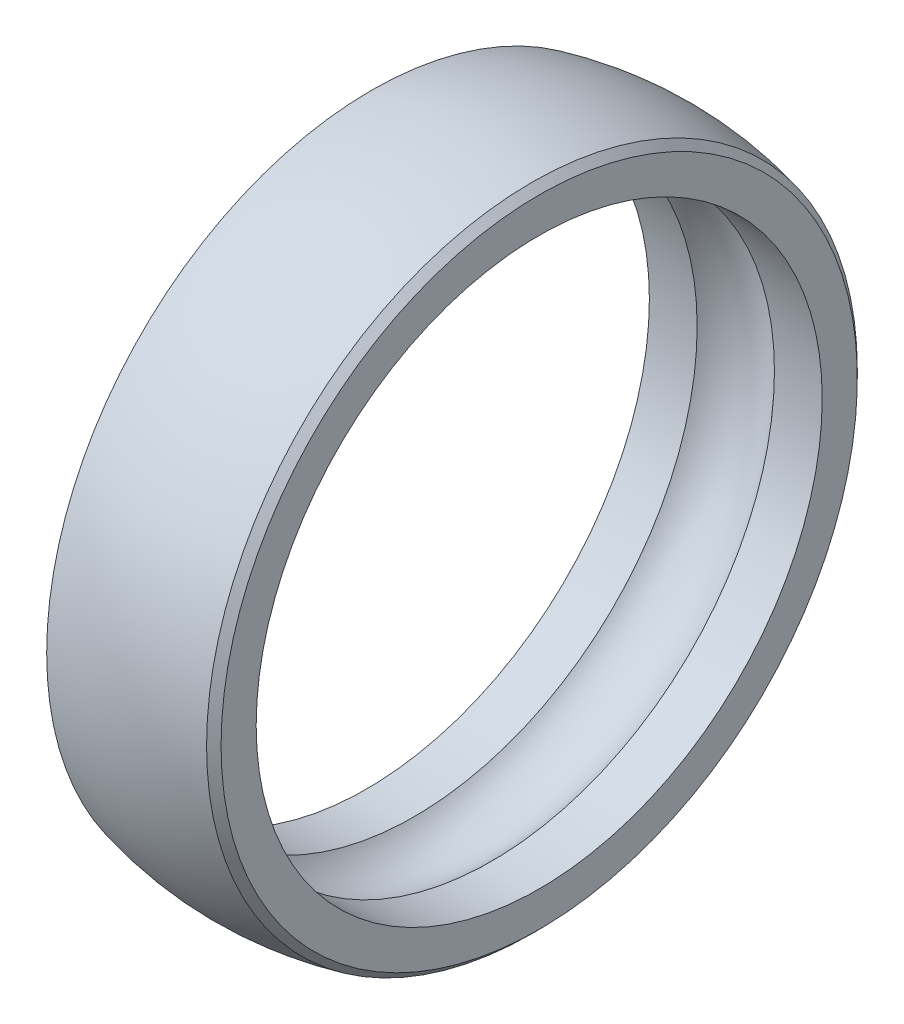
ISO-10303-21;
HEADER;
FILE_DESCRIPTION(('STEP AP214'),'2;1');
FILE_NAME('part.step','',(''),(''),'','','');
FILE_SCHEMA(('AUTOMOTIVE_DESIGN { 1 0 10303 214 1 1 1 1 }'));
ENDSEC;
DATA;
#1=APPLICATION_CONTEXT('core data for automotive mechanical design processes');
#2=APPLICATION_PROTOCOL_DEFINITION('international standard','automotive_design',2000,#1);
#3=PRODUCT_CONTEXT('',#1,'mechanical');
#4=PRODUCT('Part','Part','',(#3));
#5=PRODUCT_RELATED_PRODUCT_CATEGORY('part','',(#4));
#6=PRODUCT_DEFINITION_FORMATION('','',#4);
#7=PRODUCT_DEFINITION_CONTEXT('part definition',#1,'design');
#8=PRODUCT_DEFINITION('design','',#6,#7);
#9=PRODUCT_DEFINITION_SHAPE('','',#8);
#10=(LENGTH_UNIT() NAMED_UNIT(*) SI_UNIT(.MILLI.,.METRE.));
#11=(NAMED_UNIT(*) PLANE_ANGLE_UNIT() SI_UNIT($,.RADIAN.));
#12=(NAMED_UNIT(*) SI_UNIT($,.STERADIAN.) SOLID_ANGLE_UNIT());
#13=UNCERTAINTY_MEASURE_WITH_UNIT(LENGTH_MEASURE(1.E-05),#10,'distance_accuracy_value','');
#14=(GEOMETRIC_REPRESENTATION_CONTEXT(3) GLOBAL_UNCERTAINTY_ASSIGNED_CONTEXT((#13)) GLOBAL_UNIT_ASSIGNED_CONTEXT((#10,
#11,#12)) REPRESENTATION_CONTEXT('',''));
#15=CARTESIAN_POINT('',(0.,0.,0.));
#16=DIRECTION('',(0.,0.,1.));
#17=DIRECTION('',(1.,0.,0.));
#18=AXIS2_PLACEMENT_3D('',#15,#16,#17);
#19=CARTESIAN_POINT('',(0.,0.,-30.));
#20=DIRECTION('',(1.,0.,0.));
#21=DIRECTION('',(0.,0.,-1.));
#22=AXIS2_PLACEMENT_3D('',#19,#20,#21);
#23=PLANE('',#22);
#24=CARTESIAN_POINT('',(0.,0.,0.));
#25=DIRECTION('',(1.,0.,0.));
#26=DIRECTION('',(0.,0.,-1.));
#27=AXIS2_PLACEMENT_3D('',#24,#25,#26);
#28=CIRCLE('',#27,29.2438065793645);
#29=CARTESIAN_POINT('',(0.,0.,-29.2438065793645));
#30=VERTEX_POINT('',#29);
#31=EDGE_CURVE('E10',#30,#30,#28,.F.);
#32=ORIENTED_EDGE('',*,*,#31,.T.);
#33=EDGE_LOOP('',(#32));
#34=FACE_BOUND('',#33,.T.);
#35=CARTESIAN_POINT('',(0.,0.,0.));
#36=DIRECTION('',(-1.,0.,0.));
#37=DIRECTION('',(0.,0.,1.));
#38=AXIS2_PLACEMENT_3D('',#35,#36,#37);
#39=CIRCLE('',#38,26.2);
#40=CARTESIAN_POINT('',(0.,0.,26.2));
#41=VERTEX_POINT('',#40);
#42=EDGE_CURVE('E56',#41,#41,#39,.T.);
#43=ORIENTED_EDGE('',*,*,#42,.F.);
#44=EDGE_LOOP('',(#43));
#45=FACE_BOUND('',#44,.T.);
#46=ADVANCED_FACE('F34',(#34,#45),#23,.F.);
#47=CARTESIAN_POINT('',(16.,0.,-30.));
#48=DIRECTION('',(-1.,0.,0.));
#49=DIRECTION('',(0.,0.,1.));
#50=AXIS2_PLACEMENT_3D('',#47,#48,#49);
#51=PLANE('',#50);
#52=CARTESIAN_POINT('',(16.,0.,0.));
#53=DIRECTION('',(-1.,0.,0.));
#54=DIRECTION('',(0.,0.,1.));
#55=AXIS2_PLACEMENT_3D('',#52,#53,#54);
#56=CIRCLE('',#55,29.4499582637439);
#57=CARTESIAN_POINT('',(16.,0.,29.4499582637439));
#58=VERTEX_POINT('',#57);
#59=EDGE_CURVE('E40',#58,#58,#56,.F.);
#60=ORIENTED_EDGE('',*,*,#59,.T.);
#61=EDGE_LOOP('',(#60));
#62=FACE_BOUND('',#61,.T.);
#63=CARTESIAN_POINT('',(16.,0.,0.));
#64=DIRECTION('',(-1.,0.,0.));
#65=DIRECTION('',(0.,0.,1.));
#66=AXIS2_PLACEMENT_3D('',#63,#64,#65);
#67=CIRCLE('',#66,26.2);
#68=CARTESIAN_POINT('',(16.,0.,26.2));
#69=VERTEX_POINT('',#68);
#70=EDGE_CURVE('E65',#69,#69,#67,.T.);
#71=ORIENTED_EDGE('',*,*,#70,.T.);
#72=EDGE_LOOP('',(#71));
#73=FACE_BOUND('',#72,.T.);
#74=ADVANCED_FACE('F69',(#62,#73),#51,.F.);
#75=CARTESIAN_POINT('',(0.,0.,0.));
#76=DIRECTION('',(-1.,0.,0.));
#77=DIRECTION('',(0.,0.,1.));
#78=AXIS2_PLACEMENT_3D('',#75,#76,#77);
#79=CYLINDRICAL_SURFACE('',#78,26.2);
#80=CARTESIAN_POINT('',(4.42229123600034,0.,0.));
#81=DIRECTION('',(-1.,0.,0.));
#82=DIRECTION('',(0.,0.,1.));
#83=AXIS2_PLACEMENT_3D('',#80,#81,#82);
#84=CIRCLE('',#83,26.2);
#85=CARTESIAN_POINT('',(4.42229123600034,0.,26.2));
#86=VERTEX_POINT('',#85);
#87=EDGE_CURVE('E59',#86,#86,#84,.T.);
#88=ORIENTED_EDGE('',*,*,#87,.F.);
#89=EDGE_LOOP('',(#88));
#90=FACE_BOUND('',#89,.T.);
#91=ORIENTED_EDGE('',*,*,#42,.T.);
#92=EDGE_LOOP('',(#91));
#93=FACE_BOUND('',#92,.T.);
#94=ADVANCED_FACE('F81',(#90,#93),#79,.F.);
#95=CARTESIAN_POINT('',(8.,0.,0.));
#96=DIRECTION('',(-1.,0.,0.));
#97=DIRECTION('',(0.,0.,1.));
#98=AXIS2_PLACEMENT_3D('',#95,#96,#97);
#99=TOROIDAL_SURFACE('',#98,23.,4.8);
#100=CARTESIAN_POINT('',(11.5777087639997,0.,0.));
#101=DIRECTION('',(-1.,0.,0.));
#102=DIRECTION('',(0.,0.,1.));
#103=AXIS2_PLACEMENT_3D('',#100,#101,#102);
#104=CIRCLE('',#103,26.2);
#105=CARTESIAN_POINT('',(11.5777087639997,0.,26.2));
#106=VERTEX_POINT('',#105);
#107=EDGE_CURVE('E62',#106,#106,#104,.T.);
#108=ORIENTED_EDGE('',*,*,#107,.F.);
#109=EDGE_LOOP('',(#108));
#110=FACE_BOUND('',#109,.T.);
#111=ORIENTED_EDGE('',*,*,#87,.T.);
#112=EDGE_LOOP('',(#111));
#113=FACE_BOUND('',#112,.T.);
#114=ADVANCED_FACE('F75',(#110,#113),#99,.F.);
#115=CARTESIAN_POINT('',(0.,0.,0.));
#116=DIRECTION('',(-1.,0.,0.));
#117=DIRECTION('',(0.,0.,1.));
#118=AXIS2_PLACEMENT_3D('',#115,#116,#117);
#119=CYLINDRICAL_SURFACE('',#118,26.2);
#120=ORIENTED_EDGE('',*,*,#70,.F.);
#121=EDGE_LOOP('',(#120));
#122=FACE_BOUND('',#121,.T.);
#123=ORIENTED_EDGE('',*,*,#107,.T.);
#124=EDGE_LOOP('',(#123));
#125=FACE_BOUND('',#124,.T.);
#126=ADVANCED_FACE('F71',(#122,#125),#119,.F.);
#127=CARTESIAN_POINT('',(8.,0.,0.));
#128=DIRECTION('',(-1.,0.,0.));
#129=DIRECTION('',(0.,1.,0.));
#130=AXIS2_PLACEMENT_3D('',#127,#128,#129);
#131=SPHERICAL_SURFACE('',#130,31.);
#132=CARTESIAN_POINT('',(15.3287009450708,0.,0.));
#133=DIRECTION('',(-1.,0.,0.));
#134=DIRECTION('',(0.,0.,1.));
#135=AXIS2_PLACEMENT_3D('',#132,#133,#134);
#136=CIRCLE('',#135,30.1212573186731);
#137=CARTESIAN_POINT('',(15.3287009450708,30.1212573186731,0.));
#138=VERTEX_POINT('',#137);
#139=EDGE_CURVE('E45',#138,#138,#136,.T.);
#140=CARTESIAN_POINT('',(0.480253714426029,0.,0.));
#141=DIRECTION('',(1.,0.,0.));
#142=DIRECTION('',(0.,0.,-1.));
#143=AXIS2_PLACEMENT_3D('',#140,#141,#142);
#144=CIRCLE('',#143,30.0741320041094);
#145=CARTESIAN_POINT('',(0.48025371442601,30.0741320041094,0.));
#146=VERTEX_POINT('',#145);
#147=EDGE_CURVE('E51',#146,#146,#144,.T.);
#148=CARTESIAN_POINT('',(15.3287009450708,30.1212573186731,0.));
#149=CARTESIAN_POINT('',(15.1769382184269,30.1581822925685,0.));
#150=CARTESIAN_POINT('',(15.0248963861696,30.193960120378,0.));
#151=CARTESIAN_POINT('',(14.7202893408688,30.2632137246607,0.));
#152=CARTESIAN_POINT('',(14.5677241278254,30.2966895011339,0.));
#153=CARTESIAN_POINT('',(14.2621051513936,30.3613312435796,0.));
#154=CARTESIAN_POINT('',(14.1090513880051,30.3924972095521,0.));
#155=CARTESIAN_POINT('',(13.8024902849802,30.4525122404655,0.));
#156=CARTESIAN_POINT('',(13.6489829453438,30.4813613054064,0.));
#157=CARTESIAN_POINT('',(13.341549758961,30.5367359352943,0.));
#158=CARTESIAN_POINT('',(13.1876239122146,30.5632615002414,0.));
#159=CARTESIAN_POINT('',(12.8793888786642,30.6139830721344,0.));
#160=CARTESIAN_POINT('',(12.7250796918602,30.6381790790803,0.));
#161=CARTESIAN_POINT('',(12.4161132322101,30.6842360064733,0.));
#162=CARTESIAN_POINT('',(12.261455959364,30.7060969269204,0.));
#163=CARTESIAN_POINT('',(11.9518286613355,30.7474786870288,0.));
#164=CARTESIAN_POINT('',(11.7968586361532,30.7669995266901,0.));
#165=CARTESIAN_POINT('',(11.4866412385666,30.80369666537,0.));
#166=CARTESIAN_POINT('',(11.3313938661624,30.8208729643885,0.));
#167=CARTESIAN_POINT('',(11.0206572426224,30.8528770976223,0.));
#168=CARTESIAN_POINT('',(10.8651679914866,30.8677049318375,0.));
#169=CARTESIAN_POINT('',(10.5539831342309,30.8950087478303,0.));
#170=CARTESIAN_POINT('',(10.3982875281112,30.9074847296079,0.));
#171=CARTESIAN_POINT('',(10.0867255317809,30.9300819904094,0.));
#172=CARTESIAN_POINT('',(9.93085914157048,30.9402032694333,0.));
#173=CARTESIAN_POINT('',(9.61899118697007,30.9580888123759,0.));
#174=CARTESIAN_POINT('',(9.4629896225801,30.9658530762946,0.));
#175=CARTESIAN_POINT('',(9.15088696041432,30.9790228151694,0.));
#176=CARTESIAN_POINT('',(8.9947858626385,30.9844282901256,0.));
#177=CARTESIAN_POINT('',(8.68251979723452,30.9928792161171,0.));
#178=CARTESIAN_POINT('',(8.52635482960635,30.9959246671524,0.));
#179=CARTESIAN_POINT('',(8.21399670262313,30.9996548495254,0.));
#180=CARTESIAN_POINT('',(8.05780354326809,31.000339580863,0.));
#181=CARTESIAN_POINT('',(7.7454247173974,30.9993481674039,0.));
#182=CARTESIAN_POINT('',(7.58923905088175,30.9976720226071,0.));
#183=CARTESIAN_POINT('',(7.2769108935443,30.9919592398184,0.));
#184=CARTESIAN_POINT('',(7.12076840272249,30.9879226018265,0.));
#185=CARTESIAN_POINT('',(6.80856226976305,30.9774897548753,0.));
#186=CARTESIAN_POINT('',(6.65249862762541,30.9710935459161,0.));
#187=CARTESIAN_POINT('',(6.3404858470105,30.955943018336,0.));
#188=CARTESIAN_POINT('',(6.18453670853324,30.9471886997151,0.));
#189=CARTESIAN_POINT('',(5.87278856405532,30.9273239528612,0.));
#190=CARTESIAN_POINT('',(5.71698955805466,30.9162135246282,0.));
#191=CARTESIAN_POINT('',(5.4055772730462,30.8916390968868,0.));
#192=CARTESIAN_POINT('',(5.2499639940384,30.8781750973785,0.));
#193=CARTESIAN_POINT('',(4.93895871510013,30.8488966031294,0.));
#194=CARTESIAN_POINT('',(4.78356671516966,30.8330821083886,0.));
#195=CARTESIAN_POINT('',(4.47303949591531,30.7991062367256,0.));
#196=CARTESIAN_POINT('',(4.31790427659142,30.7809448598033,0.));
#197=CARTESIAN_POINT('',(4.00792606141751,30.7422793729933,0.));
#198=CARTESIAN_POINT('',(3.85308306556749,30.7217752631055,0.));
#199=CARTESIAN_POINT('',(3.54372467343377,30.6784289948633,0.));
#200=CARTESIAN_POINT('',(3.38920927715008,30.6555868365088,0.));
#201=CARTESIAN_POINT('',(3.08054138544215,30.6075696897985,0.));
#202=CARTESIAN_POINT('',(2.92638889001792,30.5823947014427,0.));
#203=CARTESIAN_POINT('',(2.61848201824237,30.5297176468886,0.));
#204=CARTESIAN_POINT('',(2.46472764189106,30.5022155806903,0.));
#205=CARTESIAN_POINT('',(2.15765213615239,30.4448906515577,0.));
#206=CARTESIAN_POINT('',(2.00433100676503,30.4150677886233,0.));
#207=CARTESIAN_POINT('',(1.69815702149928,30.353108087447,0.));
#208=CARTESIAN_POINT('',(1.54530416562089,30.3209712492051,0.));
#209=CARTESIAN_POINT('',(1.24010165575884,30.2543909097979,0.));
#210=CARTESIAN_POINT('',(1.08775200177517,30.2199474086326,0.));
#211=CARTESIAN_POINT('',(0.78359067619106,30.1487617234711,0.));
#212=CARTESIAN_POINT('',(0.63177900459061,30.1120195394749,0.));
#213=CARTESIAN_POINT('',(0.48025371442601,30.0741320041094,0.));
#214=B_SPLINE_CURVE_WITH_KNOTS('',3,(#148,#149,#150,#151,#152,#153,#154,#155,#156,#157,#158,
#159,#160,#161,#162,#163,#164,#165,#166,#167,#168,#169,#170,#171,#172,#173,#174,#175,#176,#177,
#178,#179,#180,#181,#182,#183,#184,#185,#186,#187,#188,#189,#190,#191,#192,#193,#194,#195,#196,
#197,#198,#199,#200,#201,#202,#203,#204,#205,#206,#207,#208,#209,#210,#211,#212,#213),
.UNSPECIFIED.,.F.,.F.,(4,2,2,2,2,2,2,2,2,2,2,2,2,2,2,2,2,2,2,2,2,2,2,2,2,2,2,2,2,2,2,2,4),(0.,
0.468566138254145,0.937132276508286,1.40569841476243,1.87426455301657,2.34283069127072,
2.81139682952486,3.279962967779,3.74852910603315,4.21709524428729,4.68566138254143,
5.15422752079558,5.62279365904972,6.09135979730386,6.55992593555801,7.02849207381215,
7.49705821206629,7.96562435032044,8.43419048857458,8.90275662682872,9.37132276508287,
9.83988890333701,10.3084550415912,10.7770211798453,11.2455873180994,11.7141534563536,
12.1827195946077,12.6512857328619,13.119851871116,13.5884180093702,14.0569841476243,
14.5255502858784,14.9941164241326),.UNSPECIFIED.);
#215=EDGE_CURVE('BSEAM74',#138,#146,#214,.T.);
#216=ORIENTED_EDGE('',*,*,#139,.T.);
#217=ORIENTED_EDGE('',*,*,#147,.T.);
#218=ORIENTED_EDGE('',*,*,#215,.T.);
#219=ORIENTED_EDGE('',*,*,#215,.F.);
#220=EDGE_LOOP('',(#216,#218,#217,#219));
#221=FACE_BOUND('',#220,.T.);
#222=ADVANCED_FACE('F74',(#221),#131,.T.);
#223=CARTESIAN_POINT('',(15.3287009450708,0.,0.));
#224=DIRECTION('',(-1.,0.,0.));
#225=DIRECTION('',(0.,0.,1.));
#226=AXIS2_PLACEMENT_3D('',#223,#224,#225);
#227=CONICAL_SURFACE('',#226,30.1212573186731,0.785398163397443);
#228=ORIENTED_EDGE('',*,*,#59,.F.);
#229=EDGE_LOOP('',(#228));
#230=FACE_BOUND('',#229,.T.);
#231=ORIENTED_EDGE('',*,*,#139,.F.);
#232=EDGE_LOOP('',(#231));
#233=FACE_BOUND('',#232,.T.);
#234=ADVANCED_FACE('F98',(#230,#233),#227,.T.);
#235=CARTESIAN_POINT('',(0.,0.,0.));
#236=DIRECTION('',(1.,0.,0.));
#237=DIRECTION('',(0.,0.,-1.));
#238=AXIS2_PLACEMENT_3D('',#235,#236,#237);
#239=CONICAL_SURFACE('',#238,29.2438065793645,1.04641648697621);
#240=ORIENTED_EDGE('',*,*,#147,.F.);
#241=EDGE_LOOP('',(#240));
#242=FACE_BOUND('',#241,.T.);
#243=ORIENTED_EDGE('',*,*,#31,.F.);
#244=EDGE_LOOP('',(#243));
#245=FACE_BOUND('',#244,.T.);
#246=ADVANCED_FACE('F102',(#242,#245),#239,.T.);
#247=CLOSED_SHELL('',(#46,#74,#94,#114,#126,#222,#234,#246));
#248=MANIFOLD_SOLID_BREP('B2',#247);
#249=ADVANCED_BREP_SHAPE_REPRESENTATION('',(#18,#248),#14);
#250=SHAPE_DEFINITION_REPRESENTATION(#9,#249);
ENDSEC;
END-ISO-10303-21;
